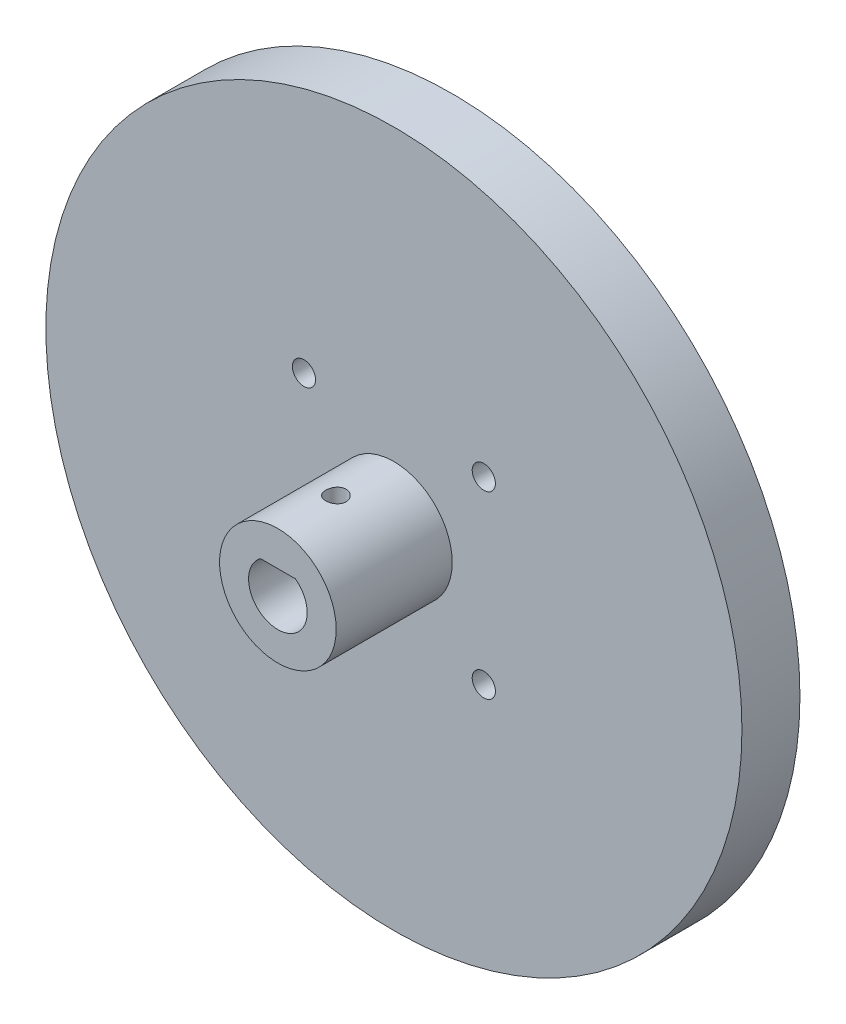
ISO-10303-21;
HEADER;
FILE_DESCRIPTION(('STEP AP214'),'2;1');
FILE_NAME('part.step','',(''),(''),'','','');
FILE_SCHEMA(('AUTOMOTIVE_DESIGN { 1 0 10303 214 1 1 1 1 }'));
ENDSEC;
DATA;
#1=APPLICATION_CONTEXT('core data for automotive mechanical design processes');
#2=APPLICATION_PROTOCOL_DEFINITION('international standard','automotive_design',2000,#1);
#3=PRODUCT_CONTEXT('',#1,'mechanical');
#4=PRODUCT('Part','Part','',(#3));
#5=PRODUCT_RELATED_PRODUCT_CATEGORY('part','',(#4));
#6=PRODUCT_DEFINITION_FORMATION('','',#4);
#7=PRODUCT_DEFINITION_CONTEXT('part definition',#1,'design');
#8=PRODUCT_DEFINITION('design','',#6,#7);
#9=PRODUCT_DEFINITION_SHAPE('','',#8);
#10=(LENGTH_UNIT() NAMED_UNIT(*) SI_UNIT(.MILLI.,.METRE.));
#11=(NAMED_UNIT(*) PLANE_ANGLE_UNIT() SI_UNIT($,.RADIAN.));
#12=(NAMED_UNIT(*) SI_UNIT($,.STERADIAN.) SOLID_ANGLE_UNIT());
#13=UNCERTAINTY_MEASURE_WITH_UNIT(LENGTH_MEASURE(1.E-05),#10,'distance_accuracy_value','');
#14=(GEOMETRIC_REPRESENTATION_CONTEXT(3) GLOBAL_UNCERTAINTY_ASSIGNED_CONTEXT((#13)) GLOBAL_UNIT_ASSIGNED_CONTEXT((#10,
#11,#12)) REPRESENTATION_CONTEXT('',''));
#15=CARTESIAN_POINT('',(0.,0.,0.));
#16=DIRECTION('',(0.,0.,1.));
#17=DIRECTION('',(1.,0.,0.));
#18=AXIS2_PLACEMENT_3D('',#15,#16,#17);
#19=CARTESIAN_POINT('',(0.,0.,30.));
#20=DIRECTION('',(0.,0.,-1.));
#21=DIRECTION('',(-1.,0.,0.));
#22=AXIS2_PLACEMENT_3D('',#19,#20,#21);
#23=CYLINDRICAL_SURFACE('',#22,5.05);
#24=CARTESIAN_POINT('',(0.,0.,10.));
#25=DIRECTION('',(0.,0.,1.));
#26=DIRECTION('',(1.,0.,0.));
#27=AXIS2_PLACEMENT_3D('',#24,#25,#26);
#28=CIRCLE('',#27,5.05);
#29=CARTESIAN_POINT('',(-3.01662062579967,4.05,10.));
#30=VERTEX_POINT('',#29);
#31=CARTESIAN_POINT('',(3.01662062579967,4.05,10.));
#32=VERTEX_POINT('',#31);
#33=EDGE_CURVE('E63',#30,#32,#28,.T.);
#34=ORIENTED_EDGE('',*,*,#33,.F.);
#35=DIRECTION('',(0.,0.,-1.));
#36=VECTOR('',#35,1.);
#37=CARTESIAN_POINT('',(-3.01662062579967,4.05,30.));
#38=LINE('',#37,#36);
#39=CARTESIAN_POINT('',(-3.01662062579967,4.05,30.));
#40=VERTEX_POINT('',#39);
#41=EDGE_CURVE('E81',#40,#30,#38,.T.);
#42=ORIENTED_EDGE('',*,*,#41,.F.);
#43=CARTESIAN_POINT('',(0.,0.,30.));
#44=DIRECTION('',(0.,0.,1.));
#45=DIRECTION('',(1.,0.,0.));
#46=AXIS2_PLACEMENT_3D('',#43,#44,#45);
#47=CIRCLE('',#46,5.05);
#48=CARTESIAN_POINT('',(3.01662062579967,4.05,30.));
#49=VERTEX_POINT('',#48);
#50=EDGE_CURVE('E79',#40,#49,#47,.T.);
#51=ORIENTED_EDGE('',*,*,#50,.T.);
#52=DIRECTION('',(0.,0.,-1.));
#53=VECTOR('',#52,1.);
#54=CARTESIAN_POINT('',(3.01662062579967,4.05,30.));
#55=LINE('',#54,#53);
#56=EDGE_CURVE('E76',#49,#32,#55,.T.);
#57=ORIENTED_EDGE('',*,*,#56,.T.);
#58=EDGE_LOOP('',(#34,#42,#51,#57));
#59=FACE_BOUND('',#58,.T.);
#60=CARTESIAN_POINT('',(0.,-5.05,21.75));
#61=CARTESIAN_POINT('',(-0.0952680507761123,-5.05000086335811,21.7500012488604));
#62=CARTESIAN_POINT('',(-0.190527220042081,-5.04727971265311,21.7421955281234));
#63=CARTESIAN_POINT('',(-0.378226805934595,-5.0366936539715,21.711283711432));
#64=CARTESIAN_POINT('',(-0.470667151591627,-5.02882861659899,21.6881772305826));
#65=CARTESIAN_POINT('',(-0.649996045478551,-5.00880626373716,21.627560094949));
#66=CARTESIAN_POINT('',(-0.736894010131133,-4.99665647049949,21.5900746735629));
#67=CARTESIAN_POINT('',(-0.903167837331774,-4.96929542290535,21.5018821726423));
#68=CARTESIAN_POINT('',(-0.982542030523708,-4.95408349145695,21.4511721681887));
#69=CARTESIAN_POINT('',(-1.13445769957149,-4.92155922249545,21.3359987930884));
#70=CARTESIAN_POINT('',(-1.20668217850294,-4.90419368003093,21.2711324272388));
#71=CARTESIAN_POINT('',(-1.3394740441814,-4.86960233249007,21.1303438877041));
#72=CARTESIAN_POINT('',(-1.40003857816514,-4.85237656259592,21.0544190163672));
#73=CARTESIAN_POINT('',(-1.50966261678891,-4.81941968522533,20.890741139261));
#74=CARTESIAN_POINT('',(-1.55829923958459,-4.80375281558617,20.8026907098381));
#75=CARTESIAN_POINT('',(-1.63993638190024,-4.77650234354841,20.6190296969602));
#76=CARTESIAN_POINT('',(-1.67294211612499,-4.76491737969395,20.5234216472824));
#77=CARTESIAN_POINT('',(-1.72117214424536,-4.74770522251506,20.3309797337761));
#78=CARTESIAN_POINT('',(-1.73699405701008,-4.74187847627543,20.2343140454818));
#79=CARTESIAN_POINT('',(-1.75227594693357,-4.73625397875975,20.0395378201581));
#80=CARTESIAN_POINT('',(-1.75174147372774,-4.73645418257099,19.9414277844808));
#81=CARTESIAN_POINT('',(-1.73478757985578,-4.74268694054093,19.751752722018));
#82=CARTESIAN_POINT('',(-1.71916232789633,-4.74842789618694,19.6601054307275));
#83=CARTESIAN_POINT('',(-1.67377126035183,-4.76461586941014,19.4808243355234));
#84=CARTESIAN_POINT('',(-1.64400362259229,-4.77506349340864,19.3931910503899));
#85=CARTESIAN_POINT('',(-1.57067921020374,-4.79968529770686,19.2226785946961));
#86=CARTESIAN_POINT('',(-1.5268962568708,-4.81391990672987,19.1399057918571));
#87=CARTESIAN_POINT('',(-1.42694116096748,-4.84448806280097,18.9826372812345));
#88=CARTESIAN_POINT('',(-1.37076521361117,-4.86082225379977,18.9081441259793));
#89=CARTESIAN_POINT('',(-1.24385978287468,-4.89488111712533,18.7651062856746));
#90=CARTESIAN_POINT('',(-1.17248554569895,-4.91263210763845,18.6971386614453));
#91=CARTESIAN_POINT('',(-1.01913687160873,-4.94671833639901,18.5739803994026));
#92=CARTESIAN_POINT('',(-0.937161248592141,-4.96305341588969,18.5187911931924));
#93=CARTESIAN_POINT('',(-0.763637793940215,-4.99271292186881,18.4222410414014));
#94=CARTESIAN_POINT('',(-0.671990889493035,-5.00600063877628,18.3810460930392));
#95=CARTESIAN_POINT('',(-0.482495700101988,-5.02780027265331,18.314841208926));
#96=CARTESIAN_POINT('',(-0.384649766514991,-5.03631398852304,18.2898251762221));
#97=CARTESIAN_POINT('',(-0.190410593873787,-5.04730275534519,18.2577369517265));
#98=CARTESIAN_POINT('',(-0.0941606865032478,-5.05003972455188,18.249885863826));
#99=CARTESIAN_POINT('',(0.0983075939528172,-5.04995942422136,18.2501165926637));
#100=CARTESIAN_POINT('',(0.194525969580356,-5.04714317891796,18.2581954712819));
#101=CARTESIAN_POINT('',(0.381006993889677,-5.03644597171253,18.2894472506183));
#102=CARTESIAN_POINT('',(0.47136173803745,-5.02872881139535,18.3121323021977));
#103=CARTESIAN_POINT('',(0.646938622712143,-5.00916958945886,18.3713327132035));
#104=CARTESIAN_POINT('',(0.732160098965977,-4.99732699532502,18.4078498581415));
#105=CARTESIAN_POINT('',(0.897658552546609,-4.97030545242837,18.4947806714886));
#106=CARTESIAN_POINT('',(0.977736034697048,-4.95504396870388,18.5455477323671));
#107=CARTESIAN_POINT('',(1.12848301646443,-4.92290325302724,18.6591273648247));
#108=CARTESIAN_POINT('',(1.19914943075696,-4.90602349364357,18.7219438703037));
#109=CARTESIAN_POINT('',(1.3326996597463,-4.87148905786298,18.8614962771112));
#110=CARTESIAN_POINT('',(1.39502808502629,-4.85383720132445,18.9387657052763));
#111=CARTESIAN_POINT('',(1.50591497313538,-4.82058936431881,19.1030388567688));
#112=CARTESIAN_POINT('',(1.55447303760646,-4.80499344333413,19.1900428616029));
#113=CARTESIAN_POINT('',(1.63628401415914,-4.77775508863369,19.3715311086978));
#114=CARTESIAN_POINT('',(1.66954380849309,-4.76611087777638,19.4660119648727));
#115=CARTESIAN_POINT('',(1.71950984890058,-4.74831581505375,19.6597367451185));
#116=CARTESIAN_POINT('',(1.73622436494427,-4.74216221891861,19.758978263591));
#117=CARTESIAN_POINT('',(1.75194941444956,-4.73637375867836,19.9534906565957));
#118=CARTESIAN_POINT('',(1.75188928497648,-4.73639670359359,20.0486769893941));
#119=CARTESIAN_POINT('',(1.73638277092701,-4.74210307560229,20.2376061994496));
#120=CARTESIAN_POINT('',(1.72093744973851,-4.74778611148372,20.3313491760135));
#121=CARTESIAN_POINT('',(1.67577848406549,-4.76390783008213,20.5126443094855));
#122=CARTESIAN_POINT('',(1.64638938019442,-4.77423807908983,20.6002877255899));
#123=CARTESIAN_POINT('',(1.57444628788312,-4.79844271579818,20.7694632012184));
#124=CARTESIAN_POINT('',(1.53188923649167,-4.81231792794956,20.8509938333816));
#125=CARTESIAN_POINT('',(1.43251401398273,-4.84285261496927,21.0097402865108));
#126=CARTESIAN_POINT('',(1.37512495979358,-4.85961152157328,21.0865794562149));
#127=CARTESIAN_POINT('',(1.24865445565418,-4.89363314755853,21.2298362192772));
#128=CARTESIAN_POINT('',(1.17956957492227,-4.91089601353495,21.2962507436861));
#129=CARTESIAN_POINT('',(1.02807301157918,-4.94488016840952,21.4196894330986));
#130=CARTESIAN_POINT('',(0.945213069067699,-4.96154543660173,21.4761809561793));
#131=CARTESIAN_POINT('',(0.770610967846133,-4.9916423883894,21.5743842170297));
#132=CARTESIAN_POINT('',(0.678870225306058,-5.00507458635682,21.6160983063446));
#133=CARTESIAN_POINT('',(0.490771612782248,-5.02697112752207,21.6826804638612));
#134=CARTESIAN_POINT('',(0.394526808340171,-5.03552067208463,21.7078386967956));
#135=CARTESIAN_POINT('',(0.198850725802715,-5.04703372212219,21.7414950224905));
#136=CARTESIAN_POINT('',(0.0994205265885841,-5.04999909901046,21.7499986967052));
#137=CARTESIAN_POINT('',(0.,-5.05,21.75));
#138=B_SPLINE_CURVE_WITH_KNOTS('',3,(#60,#61,#62,#63,#64,#65,#66,#67,#68,#69,#70,#71,#72,#73,
#74,#75,#76,#77,#78,#79,#80,#81,#82,#83,#84,#85,#86,#87,#88,#89,#90,#91,#92,#93,#94,#95,#96,#97,
#98,#99,#100,#101,#102,#103,#104,#105,#106,#107,#108,#109,#110,#111,#112,#113,#114,#115,#116,
#117,#118,#119,#120,#121,#122,#123,#124,#125,#126,#127,#128,#129,#130,#131,#132,#133,#134,#135,
#136,#137),.UNSPECIFIED.,.T.,.F.,(4,2,2,2,2,2,2,2,2,2,2,2,2,2,2,2,2,2,2,2,2,2,2,2,2,2,2,2,2,2,2,
2,2,2,2,2,2,2,4),(0.,0.285438018770491,0.570883218089465,0.855829768591308,1.14083939507189,
1.43537392023989,1.72998041593905,2.03387428929443,2.33766670743622,2.63051742275588,
2.92326877647601,3.20140855008943,3.47958417032146,3.76249674989595,4.04549630792905,
4.34454774456357,4.64363266860355,4.94615059975388,5.24855446182806,5.53692367960836,
5.8252397156006,6.10439303648591,6.3835824040799,6.67042257751986,6.95735655835492,
7.25843547488889,7.55952310034284,7.86047514232326,8.16127668075698,8.44541692679307,
8.72953753509332,9.00734740249134,9.28522193893265,9.57601116897466,9.86688584560095,
10.1703845711542,10.4738349789901,10.7718143455668,11.0696938330064),.UNSPECIFIED.);
#139=CARTESIAN_POINT('',(0.,-5.05,21.75));
#140=VERTEX_POINT('',#139);
#141=EDGE_CURVE('E91',#140,#140,#138,.T.);
#142=ORIENTED_EDGE('',*,*,#141,.T.);
#143=EDGE_LOOP('',(#142));
#144=FACE_BOUND('',#143,.T.);
#145=ADVANCED_FACE('F41',(#59,#144),#23,.F.);
#146=CARTESIAN_POINT('',(0.,0.,30.));
#147=DIRECTION('',(0.,0.,-1.));
#148=DIRECTION('',(-1.,0.,0.));
#149=AXIS2_PLACEMENT_3D('',#146,#147,#148);
#150=CYLINDRICAL_SURFACE('',#149,10.05);
#151=CARTESIAN_POINT('',(0.,0.,30.));
#152=DIRECTION('',(0.,0.,1.));
#153=DIRECTION('',(1.,0.,0.));
#154=AXIS2_PLACEMENT_3D('',#151,#152,#153);
#155=CIRCLE('',#154,10.05);
#156=CARTESIAN_POINT('',(10.05,0.,30.));
#157=VERTEX_POINT('',#156);
#158=EDGE_CURVE('E82',#157,#157,#155,.T.);
#159=ORIENTED_EDGE('',*,*,#158,.F.);
#160=EDGE_LOOP('',(#159));
#161=FACE_BOUND('',#160,.T.);
#162=CARTESIAN_POINT('',(0.,0.,10.));
#163=DIRECTION('',(0.,0.,1.));
#164=DIRECTION('',(1.,0.,0.));
#165=AXIS2_PLACEMENT_3D('',#162,#163,#164);
#166=CIRCLE('',#165,10.05);
#167=CARTESIAN_POINT('',(10.05,0.,10.));
#168=VERTEX_POINT('',#167);
#169=EDGE_CURVE('E88',#168,#168,#166,.T.);
#170=ORIENTED_EDGE('',*,*,#169,.T.);
#171=EDGE_LOOP('',(#170));
#172=FACE_BOUND('',#171,.T.);
#173=CARTESIAN_POINT('',(0.,10.05,21.75));
#174=CARTESIAN_POINT('',(0.0975080492346215,10.0499982896163,21.7499961499547));
#175=CARTESIAN_POINT('',(0.195067684983461,10.048566185362,21.7418229059682));
#176=CARTESIAN_POINT('',(0.387446244557424,10.0429911849368,21.7093620420393));
#177=CARTESIAN_POINT('',(0.48226264053044,10.0388458667576,21.6850600241309));
#178=CARTESIAN_POINT('',(0.666343948523187,10.0283089615896,21.6211013322381));
#179=CARTESIAN_POINT('',(0.755613491609108,10.0219192789028,21.5814576724613));
#180=CARTESIAN_POINT('',(0.92622364256409,10.0075945407644,21.4879761277215));
#181=CARTESIAN_POINT('',(1.00756506387441,9.99965964410597,21.4341397010693));
#182=CARTESIAN_POINT('',(1.16086593688849,9.98303055703897,21.3132058909119));
#183=CARTESIAN_POINT('',(1.23273101460357,9.97432998663465,21.2459897395491));
#184=CARTESIAN_POINT('',(1.36422357604716,9.95719847613314,21.1004601009978));
#185=CARTESIAN_POINT('',(1.42385025183916,9.94876755386817,21.0221458817302));
#186=CARTESIAN_POINT('',(1.52955662571842,9.93306807785863,20.8559883617581));
#187=CARTESIAN_POINT('',(1.57554206883131,9.92580776278395,20.7680842512031));
#188=CARTESIAN_POINT('',(1.6520576590636,9.91336056678793,20.5856513200108));
#189=CARTESIAN_POINT('',(1.68258894881693,9.90817353258034,20.491122989737));
#190=CARTESIAN_POINT('',(1.72703027912823,9.90052396795737,20.2991286838734));
#191=CARTESIAN_POINT('',(1.7411038387046,9.89803465233592,20.201701646081));
#192=CARTESIAN_POINT('',(1.75273740025284,9.89598144912296,20.0058396683238));
#193=CARTESIAN_POINT('',(1.7502986779704,9.89641733552912,19.9074048068107));
#194=CARTESIAN_POINT('',(1.72910988592802,9.9001408542765,19.7134946291459));
#195=CARTESIAN_POINT('',(1.71054427680749,9.90339623577698,19.6179984468777));
#196=CARTESIAN_POINT('',(1.65791855314059,9.91234140325852,19.4314973904065));
#197=CARTESIAN_POINT('',(1.62385786300188,9.91803127967275,19.3404926831864));
#198=CARTESIAN_POINT('',(1.54102411651827,9.93123878271003,19.1650099705017));
#199=CARTESIAN_POINT('',(1.49217519512239,9.93876579448384,19.0805685113401));
#200=CARTESIAN_POINT('',(1.38120541698475,9.95479305912909,18.9210111479224));
#201=CARTESIAN_POINT('',(1.31908339346092,9.96329339753104,18.8458960644269));
#202=CARTESIAN_POINT('',(1.1823294152795,9.98045084776868,18.7060566187173));
#203=CARTESIAN_POINT('',(1.10753936161785,9.98910852323367,18.6414868365797));
#204=CARTESIAN_POINT('',(0.948105070652428,10.0054988990485,18.5257890384695));
#205=CARTESIAN_POINT('',(0.863460758602253,10.0132315923813,18.4746611244656));
#206=CARTESIAN_POINT('',(0.686569867309045,10.0269132436078,18.3872813449015));
#207=CARTESIAN_POINT('',(0.594315987426213,10.0328604625316,18.3510439694607));
#208=CARTESIAN_POINT('',(0.404904567315678,10.0422873149106,18.2946217771648));
#209=CARTESIAN_POINT('',(0.307747476235806,10.045767173945,18.274435492813));
#210=CARTESIAN_POINT('',(0.112619057257022,10.0498366630669,18.2508999819944));
#211=CARTESIAN_POINT('',(0.014674040778144,10.0504626933083,18.2473386920471));
#212=CARTESIAN_POINT('',(-0.180412676485635,10.0488539792727,18.2565876953565));
#213=CARTESIAN_POINT('',(-0.277554410941472,10.0466193555229,18.2693972988623));
#214=CARTESIAN_POINT('',(-0.46761595880331,10.0395629953403,18.3108481014847));
#215=CARTESIAN_POINT('',(-0.560559541647794,10.0347585526632,18.3393835112815));
#216=CARTESIAN_POINT('',(-0.740343541492988,10.0230990390872,18.4113625484335));
#217=CARTESIAN_POINT('',(-0.827183589805306,10.0162438444424,18.454807075454));
#218=CARTESIAN_POINT('',(-0.993211048884295,10.0011526935002,18.555851154332));
#219=CARTESIAN_POINT('',(-1.07231727943034,9.99290415232079,18.6135821783876));
#220=CARTESIAN_POINT('',(-1.21979493040584,9.97597717895522,18.7413806540571));
#221=CARTESIAN_POINT('',(-1.2881654941053,9.96729871253267,18.8114490892783));
#222=CARTESIAN_POINT('',(-1.41302395137492,9.95037123958944,18.9628876882906));
#223=CARTESIAN_POINT('',(-1.46936805288499,9.94212823083395,19.0443771842141));
#224=CARTESIAN_POINT('',(-1.56756762929855,9.92711990972601,19.2157890127013));
#225=CARTESIAN_POINT('',(-1.60942359289985,9.92035454753406,19.3057110606974));
#226=CARTESIAN_POINT('',(-1.67724752977425,9.90911324365576,19.4910461828747));
#227=CARTESIAN_POINT('',(-1.70328511416777,9.90462728560292,19.5864331473465));
#228=CARTESIAN_POINT('',(-1.73895083667758,9.89842832921953,19.7803120389348));
#229=CARTESIAN_POINT('',(-1.74858054584408,9.89671506540494,19.8788036678604));
#230=CARTESIAN_POINT('',(-1.75111030225916,9.89626763060476,20.0746587491086));
#231=CARTESIAN_POINT('',(-1.74423683640005,9.89749312824707,20.1720192572977));
#232=CARTESIAN_POINT('',(-1.71444720604612,9.90269638384861,20.3641753850974));
#233=CARTESIAN_POINT('',(-1.69153110775159,9.90667413045061,20.4589710152904));
#234=CARTESIAN_POINT('',(-1.63039657527981,9.91691778656645,20.6432070480449));
#235=CARTESIAN_POINT('',(-1.59219938488435,9.92318051843343,20.7326546877752));
#236=CARTESIAN_POINT('',(-1.50161068561128,9.9372912599205,20.9039085550848));
#237=CARTESIAN_POINT('',(-1.4492183679388,9.94513935986352,20.9857143468977));
#238=CARTESIAN_POINT('',(-1.33092550784986,9.96166350656832,21.1405033271065));
#239=CARTESIAN_POINT('',(-1.26485894033763,9.97034895292114,21.2133586518742));
#240=CARTESIAN_POINT('',(-1.12144190810204,9.9874958269095,21.3470257452247));
#241=CARTESIAN_POINT('',(-1.04408884872981,9.99595720250357,21.4078347368797));
#242=CARTESIAN_POINT('',(-0.879592577705311,10.0117775535053,21.5161095783409));
#243=CARTESIAN_POINT('',(-0.792379334602254,10.0191276484779,21.5634703518916));
#244=CARTESIAN_POINT('',(-0.611139411810856,10.031810863116,21.6427946336176));
#245=CARTESIAN_POINT('',(-0.517119489457774,10.0371459513282,21.6747731777562));
#246=CARTESIAN_POINT('',(-0.352303056521071,10.0440600100304,21.7156377245107));
#247=CARTESIAN_POINT('',(-0.282492671360269,10.0462753702562,21.7285024702565));
#248=CARTESIAN_POINT('',(-0.141797271028174,10.0492459726933,21.7456849231922));
#249=CARTESIAN_POINT('',(-0.07091227720218,10.0500012438686,21.7500027999276));
#250=CARTESIAN_POINT('',(0.,10.05,21.75));
#251=B_SPLINE_CURVE_WITH_KNOTS('',3,(#173,#174,#175,#176,#177,#178,#179,#180,#181,#182,#183,
#184,#185,#186,#187,#188,#189,#190,#191,#192,#193,#194,#195,#196,#197,#198,#199,#200,#201,#202,
#203,#204,#205,#206,#207,#208,#209,#210,#211,#212,#213,#214,#215,#216,#217,#218,#219,#220,#221,
#222,#223,#224,#225,#226,#227,#228,#229,#230,#231,#232,#233,#234,#235,#236,#237,#238,#239,#240,
#241,#242,#243,#244,#245,#246,#247,#248,#249,#250),.UNSPECIFIED.,.T.,.F.,(4,2,2,2,2,2,2,2,2,2,2,
2,2,2,2,2,2,2,2,2,2,2,2,2,2,2,2,2,2,2,2,2,2,2,2,2,2,2,4),(0.,0.29226490022414,0.584791053434771,
0.877069600790277,1.16931812814025,1.46428688566632,1.75927510974007,2.05625648020861,
2.35321588955335,2.64719903375655,2.94115946496032,3.23180117850611,3.52245368933698,
3.81462329692551,4.10681859847884,4.40297301671345,4.69912968148154,4.99557386039815,
5.29199093331643,5.58461647471116,5.87722968739043,6.16789806933445,6.45858399424777,
6.75205151015422,7.0455424335291,7.34236701478608,7.6391815829093,7.93468033013569,
8.23015078183587,8.52158947511609,8.8130269657749,9.10406070003368,9.3951110199914,
9.68992756523923,9.9848119928889,10.2819407673354,10.5787785084028,10.7913310199621,
11.0038793150397),.UNSPECIFIED.);
#252=CARTESIAN_POINT('',(0.,10.05,21.75));
#253=VERTEX_POINT('',#252);
#254=EDGE_CURVE('E127',#253,#253,#251,.T.);
#255=ORIENTED_EDGE('',*,*,#254,.F.);
#256=EDGE_LOOP('',(#255));
#257=FACE_BOUND('',#256,.T.);
#258=CARTESIAN_POINT('',(0.,-10.05,21.75));
#259=CARTESIAN_POINT('',(-0.0975080492346215,-10.0499982896163,21.7499961499547));
#260=CARTESIAN_POINT('',(-0.195067684983461,-10.048566185362,21.7418229059682));
#261=CARTESIAN_POINT('',(-0.387446244557424,-10.0429911849368,21.7093620420393));
#262=CARTESIAN_POINT('',(-0.48226264053044,-10.0388458667576,21.6850600241309));
#263=CARTESIAN_POINT('',(-0.666343948523187,-10.0283089615896,21.6211013322381));
#264=CARTESIAN_POINT('',(-0.755613491609108,-10.0219192789028,21.5814576724613));
#265=CARTESIAN_POINT('',(-0.92622364256409,-10.0075945407644,21.4879761277215));
#266=CARTESIAN_POINT('',(-1.00756506387441,-9.99965964410597,21.4341397010693));
#267=CARTESIAN_POINT('',(-1.16086593688849,-9.98303055703897,21.3132058909119));
#268=CARTESIAN_POINT('',(-1.23273101460357,-9.97432998663465,21.2459897395491));
#269=CARTESIAN_POINT('',(-1.36422357604716,-9.95719847613314,21.1004601009978));
#270=CARTESIAN_POINT('',(-1.42385025183916,-9.94876755386817,21.0221458817302));
#271=CARTESIAN_POINT('',(-1.52955662571842,-9.93306807785863,20.8559883617581));
#272=CARTESIAN_POINT('',(-1.57554206883131,-9.92580776278395,20.7680842512031));
#273=CARTESIAN_POINT('',(-1.6520576590636,-9.91336056678793,20.5856513200108));
#274=CARTESIAN_POINT('',(-1.68258894881693,-9.90817353258034,20.491122989737));
#275=CARTESIAN_POINT('',(-1.72703027912823,-9.90052396795737,20.2991286838734));
#276=CARTESIAN_POINT('',(-1.7411038387046,-9.89803465233592,20.201701646081));
#277=CARTESIAN_POINT('',(-1.75273740025284,-9.89598144912296,20.0058396683238));
#278=CARTESIAN_POINT('',(-1.7502986779704,-9.89641733552912,19.9074048068107));
#279=CARTESIAN_POINT('',(-1.72910988592802,-9.9001408542765,19.7134946291459));
#280=CARTESIAN_POINT('',(-1.71054427680749,-9.90339623577698,19.6179984468777));
#281=CARTESIAN_POINT('',(-1.65791855314059,-9.91234140325852,19.4314973904065));
#282=CARTESIAN_POINT('',(-1.62385786300188,-9.91803127967275,19.3404926831864));
#283=CARTESIAN_POINT('',(-1.54102411651827,-9.93123878271003,19.1650099705017));
#284=CARTESIAN_POINT('',(-1.49217519512239,-9.93876579448384,19.0805685113401));
#285=CARTESIAN_POINT('',(-1.38120541698475,-9.95479305912909,18.9210111479224));
#286=CARTESIAN_POINT('',(-1.31908339346092,-9.96329339753104,18.8458960644269));
#287=CARTESIAN_POINT('',(-1.1823294152795,-9.98045084776868,18.7060566187173));
#288=CARTESIAN_POINT('',(-1.10753936161785,-9.98910852323367,18.6414868365797));
#289=CARTESIAN_POINT('',(-0.948105070652428,-10.0054988990485,18.5257890384695));
#290=CARTESIAN_POINT('',(-0.863460758602253,-10.0132315923813,18.4746611244656));
#291=CARTESIAN_POINT('',(-0.686569867309045,-10.0269132436078,18.3872813449015));
#292=CARTESIAN_POINT('',(-0.594315987426213,-10.0328604625316,18.3510439694607));
#293=CARTESIAN_POINT('',(-0.404904567315678,-10.0422873149106,18.2946217771648));
#294=CARTESIAN_POINT('',(-0.307747476235806,-10.045767173945,18.274435492813));
#295=CARTESIAN_POINT('',(-0.112619057257022,-10.0498366630669,18.2508999819944));
#296=CARTESIAN_POINT('',(-0.014674040778144,-10.0504626933083,18.2473386920471));
#297=CARTESIAN_POINT('',(0.180412676485635,-10.0488539792727,18.2565876953565));
#298=CARTESIAN_POINT('',(0.277554410941472,-10.0466193555229,18.2693972988623));
#299=CARTESIAN_POINT('',(0.46761595880331,-10.0395629953403,18.3108481014847));
#300=CARTESIAN_POINT('',(0.560559541647794,-10.0347585526632,18.3393835112815));
#301=CARTESIAN_POINT('',(0.740343541492988,-10.0230990390872,18.4113625484335));
#302=CARTESIAN_POINT('',(0.827183589805306,-10.0162438444424,18.454807075454));
#303=CARTESIAN_POINT('',(0.993211048884295,-10.0011526935002,18.555851154332));
#304=CARTESIAN_POINT('',(1.07231727943034,-9.99290415232079,18.6135821783876));
#305=CARTESIAN_POINT('',(1.21979493040584,-9.97597717895522,18.7413806540571));
#306=CARTESIAN_POINT('',(1.2881654941053,-9.96729871253267,18.8114490892783));
#307=CARTESIAN_POINT('',(1.41302395137492,-9.95037123958944,18.9628876882906));
#308=CARTESIAN_POINT('',(1.46936805288499,-9.94212823083395,19.0443771842141));
#309=CARTESIAN_POINT('',(1.56756762929855,-9.92711990972601,19.2157890127013));
#310=CARTESIAN_POINT('',(1.60942359289985,-9.92035454753406,19.3057110606974));
#311=CARTESIAN_POINT('',(1.67724752977425,-9.90911324365576,19.4910461828747));
#312=CARTESIAN_POINT('',(1.70328511416777,-9.90462728560292,19.5864331473465));
#313=CARTESIAN_POINT('',(1.73895083667758,-9.89842832921953,19.7803120389348));
#314=CARTESIAN_POINT('',(1.74858054584408,-9.89671506540494,19.8788036678604));
#315=CARTESIAN_POINT('',(1.75111030225916,-9.89626763060476,20.0746587491086));
#316=CARTESIAN_POINT('',(1.74423683640005,-9.89749312824707,20.1720192572977));
#317=CARTESIAN_POINT('',(1.71444720604612,-9.90269638384861,20.3641753850974));
#318=CARTESIAN_POINT('',(1.69153110775159,-9.90667413045061,20.4589710152904));
#319=CARTESIAN_POINT('',(1.63039657527981,-9.91691778656645,20.6432070480449));
#320=CARTESIAN_POINT('',(1.59219938488435,-9.92318051843343,20.7326546877752));
#321=CARTESIAN_POINT('',(1.50161068561128,-9.9372912599205,20.9039085550848));
#322=CARTESIAN_POINT('',(1.4492183679388,-9.94513935986352,20.9857143468977));
#323=CARTESIAN_POINT('',(1.33092550784986,-9.96166350656832,21.1405033271065));
#324=CARTESIAN_POINT('',(1.26485894033763,-9.97034895292114,21.2133586518742));
#325=CARTESIAN_POINT('',(1.12144190810204,-9.9874958269095,21.3470257452247));
#326=CARTESIAN_POINT('',(1.04408884872981,-9.99595720250357,21.4078347368797));
#327=CARTESIAN_POINT('',(0.879592577705311,-10.0117775535053,21.5161095783409));
#328=CARTESIAN_POINT('',(0.792379334602254,-10.0191276484779,21.5634703518916));
#329=CARTESIAN_POINT('',(0.611139411810856,-10.031810863116,21.6427946336176));
#330=CARTESIAN_POINT('',(0.517119489457774,-10.0371459513282,21.6747731777562));
#331=CARTESIAN_POINT('',(0.352303056521071,-10.0440600100304,21.7156377245107));
#332=CARTESIAN_POINT('',(0.282492671360269,-10.0462753702562,21.7285024702565));
#333=CARTESIAN_POINT('',(0.141797271028174,-10.0492459726933,21.7456849231922));
#334=CARTESIAN_POINT('',(0.07091227720218,-10.0500012438686,21.7500027999276));
#335=CARTESIAN_POINT('',(0.,-10.05,21.75));
#336=B_SPLINE_CURVE_WITH_KNOTS('',3,(#258,#259,#260,#261,#262,#263,#264,#265,#266,#267,#268,
#269,#270,#271,#272,#273,#274,#275,#276,#277,#278,#279,#280,#281,#282,#283,#284,#285,#286,#287,
#288,#289,#290,#291,#292,#293,#294,#295,#296,#297,#298,#299,#300,#301,#302,#303,#304,#305,#306,
#307,#308,#309,#310,#311,#312,#313,#314,#315,#316,#317,#318,#319,#320,#321,#322,#323,#324,#325,
#326,#327,#328,#329,#330,#331,#332,#333,#334,#335),.UNSPECIFIED.,.T.,.F.,(4,2,2,2,2,2,2,2,2,2,2,
2,2,2,2,2,2,2,2,2,2,2,2,2,2,2,2,2,2,2,2,2,2,2,2,2,2,2,4),(0.,0.29226490022414,0.584791053434771,
0.877069600790277,1.16931812814025,1.46428688566632,1.75927510974007,2.05625648020861,
2.35321588955335,2.64719903375655,2.94115946496032,3.23180117850611,3.52245368933698,
3.81462329692551,4.10681859847884,4.40297301671345,4.69912968148154,4.99557386039815,
5.29199093331643,5.58461647471116,5.87722968739043,6.16789806933445,6.45858399424777,
6.75205151015422,7.0455424335291,7.34236701478608,7.6391815829093,7.93468033013569,
8.23015078183587,8.52158947511609,8.8130269657749,9.10406070003368,9.3951110199914,
9.68992756523923,9.9848119928889,10.2819407673354,10.5787785084028,10.7913310199621,
11.0038793150397),.UNSPECIFIED.);
#337=CARTESIAN_POINT('',(0.,-10.05,21.75));
#338=VERTEX_POINT('',#337);
#339=EDGE_CURVE('E45',#338,#338,#336,.T.);
#340=ORIENTED_EDGE('',*,*,#339,.F.);
#341=EDGE_LOOP('',(#340));
#342=FACE_BOUND('',#341,.T.);
#343=ADVANCED_FACE('F132',(#161,#172,#257,#342),#150,.T.);
#344=CARTESIAN_POINT('',(0.,0.,10.));
#345=DIRECTION('',(0.,0.,1.));
#346=DIRECTION('',(1.,0.,0.));
#347=AXIS2_PLACEMENT_3D('',#344,#345,#346);
#348=PLANE('',#347);
#349=ORIENTED_EDGE('',*,*,#169,.F.);
#350=EDGE_LOOP('',(#349));
#351=FACE_BOUND('',#350,.T.);
#352=CARTESIAN_POINT('',(15.5000000000003,-15.5,10.));
#353=DIRECTION('',(0.,0.,1.));
#354=DIRECTION('',(1.,0.,0.));
#355=AXIS2_PLACEMENT_3D('',#352,#353,#354);
#356=CIRCLE('',#355,2.);
#357=CARTESIAN_POINT('',(17.5000000000003,-15.5,10.));
#358=VERTEX_POINT('',#357);
#359=EDGE_CURVE('E109',#358,#358,#356,.T.);
#360=ORIENTED_EDGE('',*,*,#359,.F.);
#361=EDGE_LOOP('',(#360));
#362=FACE_BOUND('',#361,.T.);
#363=CARTESIAN_POINT('',(-15.5,15.5,10.));
#364=DIRECTION('',(0.,0.,1.));
#365=DIRECTION('',(1.,0.,0.));
#366=AXIS2_PLACEMENT_3D('',#363,#364,#365);
#367=CIRCLE('',#366,2.);
#368=CARTESIAN_POINT('',(-13.5,15.5,10.));
#369=VERTEX_POINT('',#368);
#370=EDGE_CURVE('E121',#369,#369,#367,.T.);
#371=ORIENTED_EDGE('',*,*,#370,.F.);
#372=EDGE_LOOP('',(#371));
#373=FACE_BOUND('',#372,.T.);
#374=CARTESIAN_POINT('',(0.,0.,10.));
#375=DIRECTION('',(0.,0.,1.));
#376=DIRECTION('',(1.,0.,0.));
#377=AXIS2_PLACEMENT_3D('',#374,#375,#376);
#378=CIRCLE('',#377,60.);
#379=CARTESIAN_POINT('',(60.,0.,10.));
#380=VERTEX_POINT('',#379);
#381=EDGE_CURVE('E11',#380,#380,#378,.T.);
#382=ORIENTED_EDGE('',*,*,#381,.T.);
#383=EDGE_LOOP('',(#382));
#384=FACE_BOUND('',#383,.T.);
#385=CARTESIAN_POINT('',(15.5,15.5,10.));
#386=DIRECTION('',(0.,0.,1.));
#387=DIRECTION('',(1.,0.,0.));
#388=AXIS2_PLACEMENT_3D('',#385,#386,#387);
#389=CIRCLE('',#388,2.);
#390=CARTESIAN_POINT('',(17.5,15.5,10.));
#391=VERTEX_POINT('',#390);
#392=EDGE_CURVE('E115',#391,#391,#389,.T.);
#393=ORIENTED_EDGE('',*,*,#392,.F.);
#394=EDGE_LOOP('',(#393));
#395=FACE_BOUND('',#394,.T.);
#396=CARTESIAN_POINT('',(-15.4999999999997,-15.5,10.));
#397=DIRECTION('',(0.,0.,1.));
#398=DIRECTION('',(1.,0.,0.));
#399=AXIS2_PLACEMENT_3D('',#396,#397,#398);
#400=CIRCLE('',#399,2.);
#401=CARTESIAN_POINT('',(-13.4999999999997,-15.5,10.));
#402=VERTEX_POINT('',#401);
#403=EDGE_CURVE('E103',#402,#402,#400,.T.);
#404=ORIENTED_EDGE('',*,*,#403,.F.);
#405=EDGE_LOOP('',(#404));
#406=FACE_BOUND('',#405,.T.);
#407=ADVANCED_FACE('F169',(#351,#362,#373,#384,#395,#406),#348,.T.);
#408=CARTESIAN_POINT('',(0.,0.,0.));
#409=DIRECTION('',(0.,0.,1.));
#410=DIRECTION('',(1.,0.,0.));
#411=AXIS2_PLACEMENT_3D('',#408,#409,#410);
#412=PLANE('',#411);
#413=CARTESIAN_POINT('',(0.,0.,0.));
#414=DIRECTION('',(0.,0.,1.));
#415=DIRECTION('',(1.,0.,0.));
#416=AXIS2_PLACEMENT_3D('',#413,#414,#415);
#417=CIRCLE('',#416,60.);
#418=CARTESIAN_POINT('',(60.,0.,0.));
#419=VERTEX_POINT('',#418);
#420=EDGE_CURVE('E55',#419,#419,#417,.T.);
#421=ORIENTED_EDGE('',*,*,#420,.F.);
#422=EDGE_LOOP('',(#421));
#423=FACE_BOUND('',#422,.T.);
#424=CARTESIAN_POINT('',(-15.5,15.5,0.));
#425=DIRECTION('',(0.,0.,1.));
#426=DIRECTION('',(1.,0.,0.));
#427=AXIS2_PLACEMENT_3D('',#424,#425,#426);
#428=CIRCLE('',#427,2.);
#429=CARTESIAN_POINT('',(-13.5,15.5,0.));
#430=VERTEX_POINT('',#429);
#431=EDGE_CURVE('E118',#430,#430,#428,.T.);
#432=ORIENTED_EDGE('',*,*,#431,.T.);
#433=EDGE_LOOP('',(#432));
#434=FACE_BOUND('',#433,.T.);
#435=CARTESIAN_POINT('',(15.5,15.5,0.));
#436=DIRECTION('',(0.,0.,1.));
#437=DIRECTION('',(1.,0.,0.));
#438=AXIS2_PLACEMENT_3D('',#435,#436,#437);
#439=CIRCLE('',#438,2.);
#440=CARTESIAN_POINT('',(17.5,15.5,0.));
#441=VERTEX_POINT('',#440);
#442=EDGE_CURVE('E112',#441,#441,#439,.T.);
#443=ORIENTED_EDGE('',*,*,#442,.T.);
#444=EDGE_LOOP('',(#443));
#445=FACE_BOUND('',#444,.T.);
#446=CARTESIAN_POINT('',(15.5000000000003,-15.5,0.));
#447=DIRECTION('',(0.,0.,1.));
#448=DIRECTION('',(1.,0.,0.));
#449=AXIS2_PLACEMENT_3D('',#446,#447,#448);
#450=CIRCLE('',#449,2.);
#451=CARTESIAN_POINT('',(17.5000000000003,-15.5,0.));
#452=VERTEX_POINT('',#451);
#453=EDGE_CURVE('E106',#452,#452,#450,.T.);
#454=ORIENTED_EDGE('',*,*,#453,.T.);
#455=EDGE_LOOP('',(#454));
#456=FACE_BOUND('',#455,.T.);
#457=CARTESIAN_POINT('',(-15.4999999999997,-15.5,0.));
#458=DIRECTION('',(0.,0.,1.));
#459=DIRECTION('',(1.,0.,0.));
#460=AXIS2_PLACEMENT_3D('',#457,#458,#459);
#461=CIRCLE('',#460,2.);
#462=CARTESIAN_POINT('',(-13.4999999999997,-15.5,0.));
#463=VERTEX_POINT('',#462);
#464=EDGE_CURVE('E102',#463,#463,#461,.T.);
#465=ORIENTED_EDGE('',*,*,#464,.T.);
#466=EDGE_LOOP('',(#465));
#467=FACE_BOUND('',#466,.T.);
#468=ADVANCED_FACE('F171',(#423,#434,#445,#456,#467),#412,.F.);
#469=CARTESIAN_POINT('',(0.,0.,10.));
#470=DIRECTION('',(0.,0.,-1.));
#471=DIRECTION('',(-1.,0.,0.));
#472=AXIS2_PLACEMENT_3D('',#469,#470,#471);
#473=CYLINDRICAL_SURFACE('',#472,60.);
#474=ORIENTED_EDGE('',*,*,#381,.F.);
#475=EDGE_LOOP('',(#474));
#476=FACE_BOUND('',#475,.T.);
#477=ORIENTED_EDGE('',*,*,#420,.T.);
#478=EDGE_LOOP('',(#477));
#479=FACE_BOUND('',#478,.T.);
#480=ADVANCED_FACE('F43',(#476,#479),#473,.T.);
#481=CARTESIAN_POINT('',(-15.5,15.5,10.));
#482=DIRECTION('',(0.,0.,-1.));
#483=DIRECTION('',(-1.,0.,0.));
#484=AXIS2_PLACEMENT_3D('',#481,#482,#483);
#485=CYLINDRICAL_SURFACE('',#484,2.);
#486=ORIENTED_EDGE('',*,*,#370,.T.);
#487=EDGE_LOOP('',(#486));
#488=FACE_BOUND('',#487,.T.);
#489=ORIENTED_EDGE('',*,*,#431,.F.);
#490=EDGE_LOOP('',(#489));
#491=FACE_BOUND('',#490,.T.);
#492=ADVANCED_FACE('F164',(#488,#491),#485,.F.);
#493=CARTESIAN_POINT('',(15.5,15.5,10.));
#494=DIRECTION('',(0.,0.,-1.));
#495=DIRECTION('',(-1.,0.,0.));
#496=AXIS2_PLACEMENT_3D('',#493,#494,#495);
#497=CYLINDRICAL_SURFACE('',#496,2.);
#498=ORIENTED_EDGE('',*,*,#392,.T.);
#499=EDGE_LOOP('',(#498));
#500=FACE_BOUND('',#499,.T.);
#501=ORIENTED_EDGE('',*,*,#442,.F.);
#502=EDGE_LOOP('',(#501));
#503=FACE_BOUND('',#502,.T.);
#504=ADVANCED_FACE('F160',(#500,#503),#497,.F.);
#505=CARTESIAN_POINT('',(15.5000000000003,-15.5,10.));
#506=DIRECTION('',(0.,0.,-1.));
#507=DIRECTION('',(-1.,0.,0.));
#508=AXIS2_PLACEMENT_3D('',#505,#506,#507);
#509=CYLINDRICAL_SURFACE('',#508,2.);
#510=ORIENTED_EDGE('',*,*,#359,.T.);
#511=EDGE_LOOP('',(#510));
#512=FACE_BOUND('',#511,.T.);
#513=ORIENTED_EDGE('',*,*,#453,.F.);
#514=EDGE_LOOP('',(#513));
#515=FACE_BOUND('',#514,.T.);
#516=ADVANCED_FACE('F156',(#512,#515),#509,.F.);
#517=CARTESIAN_POINT('',(-15.4999999999997,-15.5,10.));
#518=DIRECTION('',(0.,0.,-1.));
#519=DIRECTION('',(-1.,0.,0.));
#520=AXIS2_PLACEMENT_3D('',#517,#518,#519);
#521=CYLINDRICAL_SURFACE('',#520,2.);
#522=ORIENTED_EDGE('',*,*,#403,.T.);
#523=EDGE_LOOP('',(#522));
#524=FACE_BOUND('',#523,.T.);
#525=ORIENTED_EDGE('',*,*,#464,.F.);
#526=EDGE_LOOP('',(#525));
#527=FACE_BOUND('',#526,.T.);
#528=ADVANCED_FACE('F153',(#524,#527),#521,.F.);
#529=CARTESIAN_POINT('',(0.,4.05,30.));
#530=DIRECTION('',(0.,1.,0.));
#531=DIRECTION('',(0.,0.,1.));
#532=AXIS2_PLACEMENT_3D('',#529,#530,#531);
#533=PLANE('',#532);
#534=CARTESIAN_POINT('',(0.,4.05,20.));
#535=DIRECTION('',(0.,1.,0.));
#536=DIRECTION('',(0.,0.,1.));
#537=AXIS2_PLACEMENT_3D('',#534,#535,#536);
#538=CIRCLE('',#537,1.75);
#539=CARTESIAN_POINT('',(0.,4.05,21.75));
#540=VERTEX_POINT('',#539);
#541=EDGE_CURVE('E94',#540,#540,#538,.F.);
#542=ORIENTED_EDGE('',*,*,#541,.F.);
#543=EDGE_LOOP('',(#542));
#544=FACE_BOUND('',#543,.T.);
#545=DIRECTION('',(1.,0.,0.));
#546=VECTOR('',#545,1.);
#547=CARTESIAN_POINT('',(0.,4.05,10.));
#548=LINE('',#547,#546);
#549=EDGE_CURVE('E85',#30,#32,#548,.T.);
#550=ORIENTED_EDGE('',*,*,#549,.T.);
#551=ORIENTED_EDGE('',*,*,#56,.F.);
#552=DIRECTION('',(1.,0.,0.));
#553=VECTOR('',#552,1.);
#554=CARTESIAN_POINT('',(0.,4.05,30.));
#555=LINE('',#554,#553);
#556=EDGE_CURVE('E71',#40,#49,#555,.T.);
#557=ORIENTED_EDGE('',*,*,#556,.F.);
#558=ORIENTED_EDGE('',*,*,#41,.T.);
#559=EDGE_LOOP('',(#550,#551,#557,#558));
#560=FACE_BOUND('',#559,.T.);
#561=ADVANCED_FACE('F86',(#544,#560),#533,.F.);
#562=CARTESIAN_POINT('',(0.,0.,30.));
#563=DIRECTION('',(0.,0.,1.));
#564=DIRECTION('',(1.,0.,0.));
#565=AXIS2_PLACEMENT_3D('',#562,#563,#564);
#566=PLANE('',#565);
#567=ORIENTED_EDGE('',*,*,#50,.F.);
#568=ORIENTED_EDGE('',*,*,#556,.T.);
#569=EDGE_LOOP('',(#567,#568));
#570=FACE_BOUND('',#569,.T.);
#571=ORIENTED_EDGE('',*,*,#158,.T.);
#572=EDGE_LOOP('',(#571));
#573=FACE_BOUND('',#572,.T.);
#574=ADVANCED_FACE('F141',(#570,#573),#566,.T.);
#575=ORIENTED_EDGE('',*,*,#33,.T.);
#576=ORIENTED_EDGE('',*,*,#549,.F.);
#577=EDGE_LOOP('',(#575,#576));
#578=FACE_BOUND('',#577,.T.);
#579=ADVANCED_FACE('F90',(#578),#348,.T.);
#580=CARTESIAN_POINT('',(0.,-15.95,20.));
#581=DIRECTION('',(0.,1.,0.));
#582=DIRECTION('',(0.,0.,1.));
#583=AXIS2_PLACEMENT_3D('',#580,#581,#582);
#584=CYLINDRICAL_SURFACE('',#583,1.75);
#585=ORIENTED_EDGE('',*,*,#254,.T.);
#586=EDGE_LOOP('',(#585));
#587=FACE_BOUND('',#586,.T.);
#588=ORIENTED_EDGE('',*,*,#541,.T.);
#589=EDGE_LOOP('',(#588));
#590=FACE_BOUND('',#589,.T.);
#591=ADVANCED_FACE('F136',(#587,#590),#584,.F.);
#592=ORIENTED_EDGE('',*,*,#141,.F.);
#593=EDGE_LOOP('',(#592));
#594=FACE_BOUND('',#593,.T.);
#595=ORIENTED_EDGE('',*,*,#339,.T.);
#596=EDGE_LOOP('',(#595));
#597=FACE_BOUND('',#596,.T.);
#598=ADVANCED_FACE('F139',(#594,#597),#584,.F.);
#599=CLOSED_SHELL('',(#145,#343,#407,#468,#480,#492,#504,#516,#528,#561,#574,#579,#591,#598));
#600=MANIFOLD_SOLID_BREP('B2',#599);
#601=ADVANCED_BREP_SHAPE_REPRESENTATION('',(#18,#600),#14);
#602=SHAPE_DEFINITION_REPRESENTATION(#9,#601);
ENDSEC;
END-ISO-10303-21;
